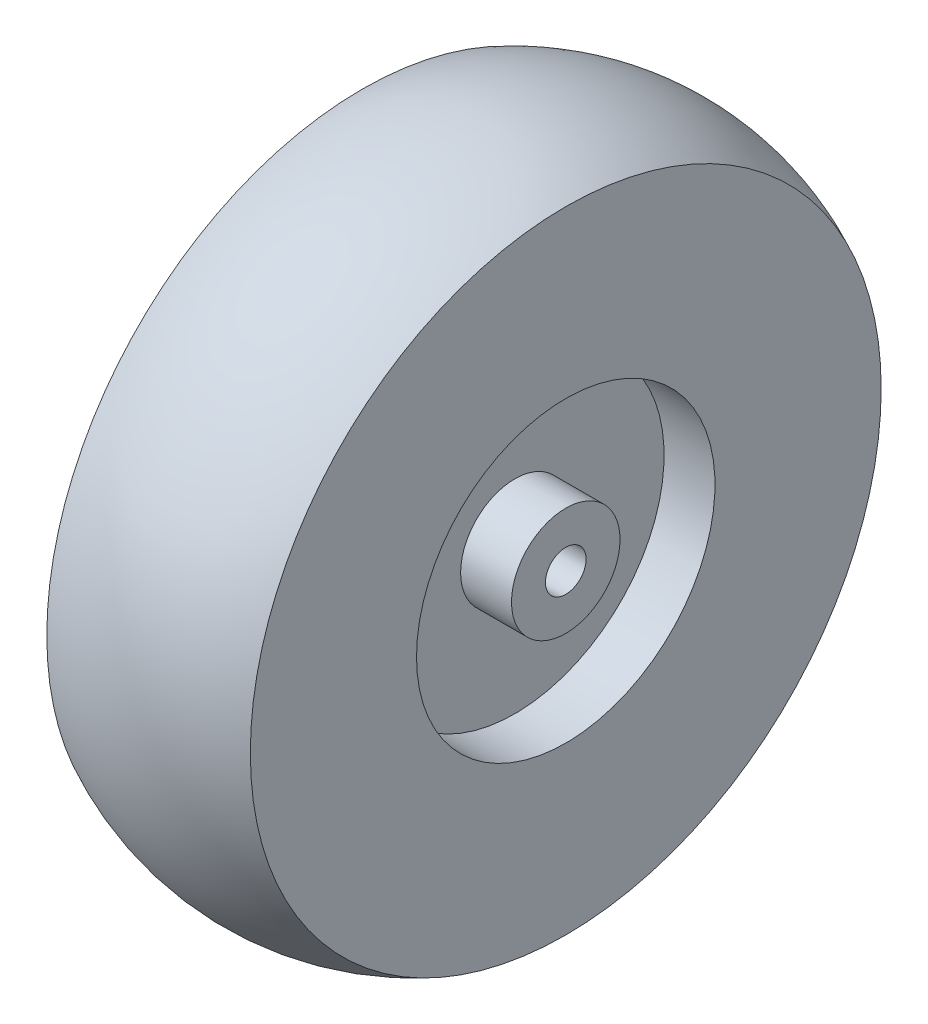
ISO-10303-21;
HEADER;
FILE_DESCRIPTION(('STEP AP214'),'2;1');
FILE_NAME('part.step','',(''),(''),'','','');
FILE_SCHEMA(('AUTOMOTIVE_DESIGN { 1 0 10303 214 1 1 1 1 }'));
ENDSEC;
DATA;
#1=APPLICATION_CONTEXT('core data for automotive mechanical design processes');
#2=APPLICATION_PROTOCOL_DEFINITION('international standard','automotive_design',2000,#1);
#3=PRODUCT_CONTEXT('',#1,'mechanical');
#4=PRODUCT('Part','Part','',(#3));
#5=PRODUCT_RELATED_PRODUCT_CATEGORY('part','',(#4));
#6=PRODUCT_DEFINITION_FORMATION('','',#4);
#7=PRODUCT_DEFINITION_CONTEXT('part definition',#1,'design');
#8=PRODUCT_DEFINITION('design','',#6,#7);
#9=PRODUCT_DEFINITION_SHAPE('','',#8);
#10=(LENGTH_UNIT() NAMED_UNIT(*) SI_UNIT(.MILLI.,.METRE.));
#11=(NAMED_UNIT(*) PLANE_ANGLE_UNIT() SI_UNIT($,.RADIAN.));
#12=(NAMED_UNIT(*) SI_UNIT($,.STERADIAN.) SOLID_ANGLE_UNIT());
#13=UNCERTAINTY_MEASURE_WITH_UNIT(LENGTH_MEASURE(1.E-05),#10,'distance_accuracy_value','');
#14=(GEOMETRIC_REPRESENTATION_CONTEXT(3) GLOBAL_UNCERTAINTY_ASSIGNED_CONTEXT((#13)) GLOBAL_UNIT_ASSIGNED_CONTEXT((#10,
#11,#12)) REPRESENTATION_CONTEXT('',''));
#15=CARTESIAN_POINT('',(0.,0.,0.));
#16=DIRECTION('',(0.,0.,1.));
#17=DIRECTION('',(1.,0.,0.));
#18=AXIS2_PLACEMENT_3D('',#15,#16,#17);
#19=CARTESIAN_POINT('',(-30.,16.,0.));
#20=DIRECTION('',(1.,0.,0.));
#21=DIRECTION('',(0.,0.,-1.));
#22=AXIS2_PLACEMENT_3D('',#19,#20,#21);
#23=PLANE('',#22);
#24=CARTESIAN_POINT('',(-30.,0.,0.));
#25=DIRECTION('',(-1.,0.,0.));
#26=DIRECTION('',(0.,0.,1.));
#27=AXIS2_PLACEMENT_3D('',#24,#25,#26);
#28=CIRCLE('',#27,6.);
#29=CARTESIAN_POINT('',(-30.,0.,6.));
#30=VERTEX_POINT('',#29);
#31=EDGE_CURVE('E10',#30,#30,#28,.T.);
#32=ORIENTED_EDGE('',*,*,#31,.F.);
#33=EDGE_LOOP('',(#32));
#34=FACE_BOUND('',#33,.T.);
#35=CARTESIAN_POINT('',(-30.,0.,0.));
#36=DIRECTION('',(-1.,0.,0.));
#37=DIRECTION('',(0.,0.,1.));
#38=AXIS2_PLACEMENT_3D('',#35,#36,#37);
#39=CIRCLE('',#38,16.);
#40=CARTESIAN_POINT('',(-30.,0.,16.));
#41=VERTEX_POINT('',#40);
#42=EDGE_CURVE('E71',#41,#41,#39,.T.);
#43=ORIENTED_EDGE('',*,*,#42,.T.);
#44=EDGE_LOOP('',(#43));
#45=FACE_BOUND('',#44,.T.);
#46=ADVANCED_FACE('F31',(#34,#45),#23,.F.);
#47=CARTESIAN_POINT('',(-108.739304751094,0.,0.));
#48=DIRECTION('',(-1.,0.,0.));
#49=DIRECTION('',(0.,0.,1.));
#50=AXIS2_PLACEMENT_3D('',#47,#48,#49);
#51=CYLINDRICAL_SURFACE('',#50,6.);
#52=CARTESIAN_POINT('',(30.,0.,0.));
#53=DIRECTION('',(-1.,0.,0.));
#54=DIRECTION('',(0.,0.,1.));
#55=AXIS2_PLACEMENT_3D('',#52,#53,#54);
#56=CIRCLE('',#55,6.);
#57=CARTESIAN_POINT('',(30.,0.,6.));
#58=VERTEX_POINT('',#57);
#59=EDGE_CURVE('E37',#58,#58,#56,.T.);
#60=ORIENTED_EDGE('',*,*,#59,.F.);
#61=EDGE_LOOP('',(#60));
#62=FACE_BOUND('',#61,.T.);
#63=ORIENTED_EDGE('',*,*,#31,.T.);
#64=EDGE_LOOP('',(#63));
#65=FACE_BOUND('',#64,.T.);
#66=ADVANCED_FACE('F132',(#62,#65),#51,.F.);
#67=CARTESIAN_POINT('',(30.,6.,0.));
#68=DIRECTION('',(-1.,0.,0.));
#69=DIRECTION('',(0.,0.,1.));
#70=AXIS2_PLACEMENT_3D('',#67,#68,#69);
#71=PLANE('',#70);
#72=CARTESIAN_POINT('',(30.,0.,0.));
#73=DIRECTION('',(-1.,0.,0.));
#74=DIRECTION('',(0.,0.,1.));
#75=AXIS2_PLACEMENT_3D('',#72,#73,#74);
#76=CIRCLE('',#75,16.);
#77=CARTESIAN_POINT('',(30.,0.,16.));
#78=VERTEX_POINT('',#77);
#79=EDGE_CURVE('E41',#78,#78,#76,.T.);
#80=ORIENTED_EDGE('',*,*,#79,.F.);
#81=EDGE_LOOP('',(#80));
#82=FACE_BOUND('',#81,.T.);
#83=ORIENTED_EDGE('',*,*,#59,.T.);
#84=EDGE_LOOP('',(#83));
#85=FACE_BOUND('',#84,.T.);
#86=ADVANCED_FACE('F127',(#82,#85),#71,.F.);
#87=CARTESIAN_POINT('',(-108.739304751094,0.,0.));
#88=DIRECTION('',(-1.,0.,0.));
#89=DIRECTION('',(0.,0.,1.));
#90=AXIS2_PLACEMENT_3D('',#87,#88,#89);
#91=CYLINDRICAL_SURFACE('',#90,16.);
#92=CARTESIAN_POINT('',(15.,0.,0.));
#93=DIRECTION('',(-1.,0.,0.));
#94=DIRECTION('',(0.,0.,1.));
#95=AXIS2_PLACEMENT_3D('',#92,#93,#94);
#96=CIRCLE('',#95,16.);
#97=CARTESIAN_POINT('',(15.,0.,16.));
#98=VERTEX_POINT('',#97);
#99=EDGE_CURVE('E45',#98,#98,#96,.T.);
#100=ORIENTED_EDGE('',*,*,#99,.F.);
#101=EDGE_LOOP('',(#100));
#102=FACE_BOUND('',#101,.T.);
#103=ORIENTED_EDGE('',*,*,#79,.T.);
#104=EDGE_LOOP('',(#103));
#105=FACE_BOUND('',#104,.T.);
#106=ADVANCED_FACE('F121',(#102,#105),#91,.T.);
#107=CARTESIAN_POINT('',(15.,16.,0.));
#108=DIRECTION('',(-1.,0.,0.));
#109=DIRECTION('',(0.,0.,1.));
#110=AXIS2_PLACEMENT_3D('',#107,#108,#109);
#111=PLANE('',#110);
#112=CARTESIAN_POINT('',(15.,0.,0.));
#113=DIRECTION('',(-1.,0.,0.));
#114=DIRECTION('',(0.,0.,1.));
#115=AXIS2_PLACEMENT_3D('',#112,#113,#114);
#116=CIRCLE('',#115,44.);
#117=CARTESIAN_POINT('',(15.,0.,44.));
#118=VERTEX_POINT('',#117);
#119=EDGE_CURVE('E50',#118,#118,#116,.T.);
#120=ORIENTED_EDGE('',*,*,#119,.F.);
#121=EDGE_LOOP('',(#120));
#122=FACE_BOUND('',#121,.T.);
#123=ORIENTED_EDGE('',*,*,#99,.T.);
#124=EDGE_LOOP('',(#123));
#125=FACE_BOUND('',#124,.T.);
#126=ADVANCED_FACE('F115',(#122,#125),#111,.F.);
#127=CARTESIAN_POINT('',(-108.739304751094,0.,0.));
#128=DIRECTION('',(-1.,0.,0.));
#129=DIRECTION('',(0.,0.,1.));
#130=AXIS2_PLACEMENT_3D('',#127,#128,#129);
#131=CYLINDRICAL_SURFACE('',#130,44.);
#132=CARTESIAN_POINT('',(30.,0.,0.));
#133=DIRECTION('',(-1.,0.,0.));
#134=DIRECTION('',(0.,0.,1.));
#135=AXIS2_PLACEMENT_3D('',#132,#133,#134);
#136=CIRCLE('',#135,44.);
#137=CARTESIAN_POINT('',(30.,0.,44.));
#138=VERTEX_POINT('',#137);
#139=EDGE_CURVE('E53',#138,#138,#136,.T.);
#140=ORIENTED_EDGE('',*,*,#139,.F.);
#141=EDGE_LOOP('',(#140));
#142=FACE_BOUND('',#141,.T.);
#143=ORIENTED_EDGE('',*,*,#119,.T.);
#144=EDGE_LOOP('',(#143));
#145=FACE_BOUND('',#144,.T.);
#146=ADVANCED_FACE('F109',(#142,#145),#131,.F.);
#147=CARTESIAN_POINT('',(30.,44.,0.));
#148=DIRECTION('',(-1.,0.,0.));
#149=DIRECTION('',(0.,0.,1.));
#150=AXIS2_PLACEMENT_3D('',#147,#148,#149);
#151=PLANE('',#150);
#152=CARTESIAN_POINT('',(30.,0.,0.));
#153=DIRECTION('',(-1.,0.,0.));
#154=DIRECTION('',(0.,0.,1.));
#155=AXIS2_PLACEMENT_3D('',#152,#153,#154);
#156=CIRCLE('',#155,93.);
#157=CARTESIAN_POINT('',(30.,0.,93.));
#158=VERTEX_POINT('',#157);
#159=EDGE_CURVE('E56',#158,#158,#156,.T.);
#160=ORIENTED_EDGE('',*,*,#159,.F.);
#161=EDGE_LOOP('',(#160));
#162=FACE_BOUND('',#161,.T.);
#163=ORIENTED_EDGE('',*,*,#139,.T.);
#164=EDGE_LOOP('',(#163));
#165=FACE_BOUND('',#164,.T.);
#166=ADVANCED_FACE('F103',(#162,#165),#151,.F.);
#167=CARTESIAN_POINT('',(0.,0.,0.));
#168=DIRECTION('',(-1.,0.,0.));
#169=DIRECTION('',(0.,0.,1.));
#170=AXIS2_PLACEMENT_3D('',#167,#168,#169);
#171=DEGENERATE_TOROIDAL_SURFACE('',#170,32.2142857142858,67.7857142857142,.T.);
#172=CARTESIAN_POINT('',(-30.,0.,0.));
#173=DIRECTION('',(-1.,0.,0.));
#174=DIRECTION('',(0.,0.,1.));
#175=AXIS2_PLACEMENT_3D('',#172,#173,#174);
#176=CIRCLE('',#175,93.);
#177=CARTESIAN_POINT('',(-30.,0.,93.));
#178=VERTEX_POINT('',#177);
#179=EDGE_CURVE('E59',#178,#178,#176,.T.);
#180=ORIENTED_EDGE('',*,*,#179,.F.);
#181=EDGE_LOOP('',(#180));
#182=FACE_BOUND('',#181,.T.);
#183=ORIENTED_EDGE('',*,*,#159,.T.);
#184=EDGE_LOOP('',(#183));
#185=FACE_BOUND('',#184,.T.);
#186=ADVANCED_FACE('F97',(#182,#185),#171,.T.);
#187=CARTESIAN_POINT('',(-30.,93.,0.));
#188=DIRECTION('',(1.,0.,0.));
#189=DIRECTION('',(0.,0.,-1.));
#190=AXIS2_PLACEMENT_3D('',#187,#188,#189);
#191=PLANE('',#190);
#192=CARTESIAN_POINT('',(-30.,0.,0.));
#193=DIRECTION('',(-1.,0.,0.));
#194=DIRECTION('',(0.,0.,1.));
#195=AXIS2_PLACEMENT_3D('',#192,#193,#194);
#196=CIRCLE('',#195,44.);
#197=CARTESIAN_POINT('',(-30.,0.,44.));
#198=VERTEX_POINT('',#197);
#199=EDGE_CURVE('E62',#198,#198,#196,.T.);
#200=ORIENTED_EDGE('',*,*,#199,.F.);
#201=EDGE_LOOP('',(#200));
#202=FACE_BOUND('',#201,.T.);
#203=ORIENTED_EDGE('',*,*,#179,.T.);
#204=EDGE_LOOP('',(#203));
#205=FACE_BOUND('',#204,.T.);
#206=ADVANCED_FACE('F91',(#202,#205),#191,.F.);
#207=CARTESIAN_POINT('',(-108.739304751094,0.,0.));
#208=DIRECTION('',(-1.,0.,0.));
#209=DIRECTION('',(0.,0.,1.));
#210=AXIS2_PLACEMENT_3D('',#207,#208,#209);
#211=CYLINDRICAL_SURFACE('',#210,44.);
#212=CARTESIAN_POINT('',(-15.,0.,0.));
#213=DIRECTION('',(-1.,0.,0.));
#214=DIRECTION('',(0.,0.,1.));
#215=AXIS2_PLACEMENT_3D('',#212,#213,#214);
#216=CIRCLE('',#215,44.);
#217=CARTESIAN_POINT('',(-15.,0.,44.));
#218=VERTEX_POINT('',#217);
#219=EDGE_CURVE('E65',#218,#218,#216,.T.);
#220=ORIENTED_EDGE('',*,*,#219,.F.);
#221=EDGE_LOOP('',(#220));
#222=FACE_BOUND('',#221,.T.);
#223=ORIENTED_EDGE('',*,*,#199,.T.);
#224=EDGE_LOOP('',(#223));
#225=FACE_BOUND('',#224,.T.);
#226=ADVANCED_FACE('F85',(#222,#225),#211,.F.);
#227=CARTESIAN_POINT('',(-15.,44.,0.));
#228=DIRECTION('',(1.,0.,0.));
#229=DIRECTION('',(0.,0.,-1.));
#230=AXIS2_PLACEMENT_3D('',#227,#228,#229);
#231=PLANE('',#230);
#232=CARTESIAN_POINT('',(-15.,0.,0.));
#233=DIRECTION('',(-1.,0.,0.));
#234=DIRECTION('',(0.,0.,1.));
#235=AXIS2_PLACEMENT_3D('',#232,#233,#234);
#236=CIRCLE('',#235,16.);
#237=CARTESIAN_POINT('',(-15.,0.,16.));
#238=VERTEX_POINT('',#237);
#239=EDGE_CURVE('E68',#238,#238,#236,.T.);
#240=ORIENTED_EDGE('',*,*,#239,.F.);
#241=EDGE_LOOP('',(#240));
#242=FACE_BOUND('',#241,.T.);
#243=ORIENTED_EDGE('',*,*,#219,.T.);
#244=EDGE_LOOP('',(#243));
#245=FACE_BOUND('',#244,.T.);
#246=ADVANCED_FACE('F79',(#242,#245),#231,.F.);
#247=CARTESIAN_POINT('',(-108.739304751094,0.,0.));
#248=DIRECTION('',(-1.,0.,0.));
#249=DIRECTION('',(0.,0.,1.));
#250=AXIS2_PLACEMENT_3D('',#247,#248,#249);
#251=CYLINDRICAL_SURFACE('',#250,16.);
#252=ORIENTED_EDGE('',*,*,#42,.F.);
#253=EDGE_LOOP('',(#252));
#254=FACE_BOUND('',#253,.T.);
#255=ORIENTED_EDGE('',*,*,#239,.T.);
#256=EDGE_LOOP('',(#255));
#257=FACE_BOUND('',#256,.T.);
#258=ADVANCED_FACE('F76',(#254,#257),#251,.T.);
#259=CLOSED_SHELL('',(#46,#66,#86,#106,#126,#146,#166,#186,#206,#226,#246,#258));
#260=MANIFOLD_SOLID_BREP('B2',#259);
#261=ADVANCED_BREP_SHAPE_REPRESENTATION('',(#18,#260),#14);
#262=SHAPE_DEFINITION_REPRESENTATION(#9,#261);
ENDSEC;
END-ISO-10303-21;
